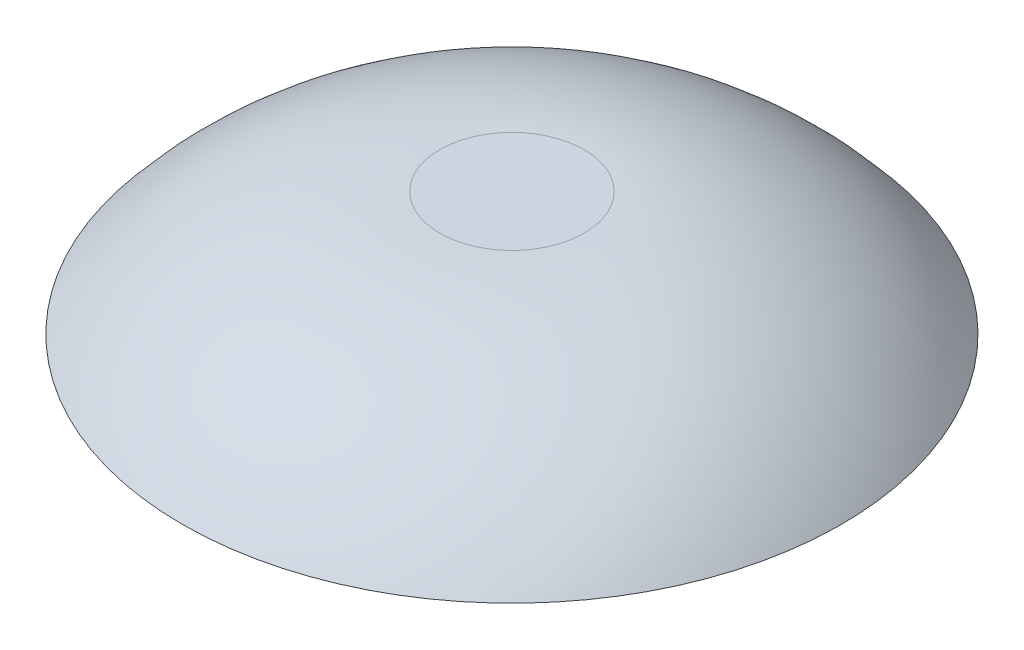
ISO-10303-21;
HEADER;
FILE_DESCRIPTION(('STEP AP214'),'2;1');
FILE_NAME('part.step','',(''),(''),'','','');
FILE_SCHEMA(('AUTOMOTIVE_DESIGN { 1 0 10303 214 1 1 1 1 }'));
ENDSEC;
DATA;
#1=APPLICATION_CONTEXT('core data for automotive mechanical design processes');
#2=APPLICATION_PROTOCOL_DEFINITION('international standard','automotive_design',2000,#1);
#3=PRODUCT_CONTEXT('',#1,'mechanical');
#4=PRODUCT('Part','Part','',(#3));
#5=PRODUCT_RELATED_PRODUCT_CATEGORY('part','',(#4));
#6=PRODUCT_DEFINITION_FORMATION('','',#4);
#7=PRODUCT_DEFINITION_CONTEXT('part definition',#1,'design');
#8=PRODUCT_DEFINITION('design','',#6,#7);
#9=PRODUCT_DEFINITION_SHAPE('','',#8);
#10=(LENGTH_UNIT() NAMED_UNIT(*) SI_UNIT(.MILLI.,.METRE.));
#11=(NAMED_UNIT(*) PLANE_ANGLE_UNIT() SI_UNIT($,.RADIAN.));
#12=(NAMED_UNIT(*) SI_UNIT($,.STERADIAN.) SOLID_ANGLE_UNIT());
#13=UNCERTAINTY_MEASURE_WITH_UNIT(LENGTH_MEASURE(1.E-05),#10,'distance_accuracy_value','');
#14=(GEOMETRIC_REPRESENTATION_CONTEXT(3) GLOBAL_UNCERTAINTY_ASSIGNED_CONTEXT((#13)) GLOBAL_UNIT_ASSIGNED_CONTEXT((#10,
#11,#12)) REPRESENTATION_CONTEXT('',''));
#15=CARTESIAN_POINT('',(0.,0.,0.));
#16=DIRECTION('',(0.,0.,1.));
#17=DIRECTION('',(1.,0.,0.));
#18=AXIS2_PLACEMENT_3D('',#15,#16,#17);
#19=CARTESIAN_POINT('',(3.1,7.,0.));
#20=DIRECTION('',(1.,0.,0.));
#21=DIRECTION('',(0.,0.,-1.));
#22=AXIS2_PLACEMENT_3D('',#19,#20,#21);
#23=PLANE('',#22);
#24=DIRECTION('',(0.,-1.,0.));
#25=VECTOR('',#24,1.);
#26=CARTESIAN_POINT('',(3.1,7.,1.78978583448784));
#27=LINE('',#26,#25);
#28=CARTESIAN_POINT('',(3.1,7.,1.78978583448784));
#29=VERTEX_POINT('',#28);
#30=CARTESIAN_POINT('',(3.1,2.5,1.78978583448784));
#31=VERTEX_POINT('',#30);
#32=EDGE_CURVE('E107',#29,#31,#27,.T.);
#33=ORIENTED_EDGE('',*,*,#32,.T.);
#34=DIRECTION('',(0.,0.,-1.));
#35=VECTOR('',#34,1.);
#36=CARTESIAN_POINT('',(3.1,2.5,0.));
#37=LINE('',#36,#35);
#38=CARTESIAN_POINT('',(3.1,2.5,-1.78978583448784));
#39=VERTEX_POINT('',#38);
#40=EDGE_CURVE('E96',#31,#39,#37,.T.);
#41=ORIENTED_EDGE('',*,*,#40,.T.);
#42=DIRECTION('',(0.,-1.,0.));
#43=VECTOR('',#42,1.);
#44=CARTESIAN_POINT('',(3.1,7.,-1.78978583448784));
#45=LINE('',#44,#43);
#46=CARTESIAN_POINT('',(3.1,7.,-1.78978583448784));
#47=VERTEX_POINT('',#46);
#48=EDGE_CURVE('E105',#47,#39,#45,.T.);
#49=ORIENTED_EDGE('',*,*,#48,.F.);
#50=DIRECTION('',(0.,0.,1.));
#51=VECTOR('',#50,1.);
#52=CARTESIAN_POINT('',(3.1,7.,0.));
#53=LINE('',#52,#51);
#54=EDGE_CURVE('E269',#47,#29,#53,.T.);
#55=ORIENTED_EDGE('',*,*,#54,.T.);
#56=EDGE_LOOP('',(#33,#41,#49,#55));
#57=FACE_BOUND('',#56,.T.);
#58=ADVANCED_FACE('F43',(#57),#23,.T.);
#59=CARTESIAN_POINT('',(1.55,7.,2.68467875173176));
#60=DIRECTION('',(0.5,0.,0.866025403784439));
#61=DIRECTION('',(0.866025403784439,0.,-0.5));
#62=AXIS2_PLACEMENT_3D('',#59,#60,#61);
#63=PLANE('',#62);
#64=DIRECTION('',(0.,-1.,0.));
#65=VECTOR('',#64,1.);
#66=CARTESIAN_POINT('',(0.,7.,3.57957166897568));
#67=LINE('',#66,#65);
#68=CARTESIAN_POINT('',(0.,7.,3.57957166897568));
#69=VERTEX_POINT('',#68);
#70=CARTESIAN_POINT('',(0.,2.5,3.57957166897568));
#71=VERTEX_POINT('',#70);
#72=EDGE_CURVE('E282',#69,#71,#67,.T.);
#73=ORIENTED_EDGE('',*,*,#72,.T.);
#74=DIRECTION('',(0.866025403784439,0.,-0.5));
#75=VECTOR('',#74,1.);
#76=CARTESIAN_POINT('',(1.55,2.5,2.68467875173176));
#77=LINE('',#76,#75);
#78=EDGE_CURVE('E110',#71,#31,#77,.T.);
#79=ORIENTED_EDGE('',*,*,#78,.T.);
#80=ORIENTED_EDGE('',*,*,#32,.F.);
#81=DIRECTION('',(-0.866025403784439,0.,0.5));
#82=VECTOR('',#81,1.);
#83=CARTESIAN_POINT('',(1.55,7.,2.68467875173176));
#84=LINE('',#83,#82);
#85=EDGE_CURVE('E66',#29,#69,#84,.T.);
#86=ORIENTED_EDGE('',*,*,#85,.T.);
#87=EDGE_LOOP('',(#73,#79,#80,#86));
#88=FACE_BOUND('',#87,.T.);
#89=ADVANCED_FACE('F149',(#88),#63,.T.);
#90=CARTESIAN_POINT('',(-1.55,7.,2.68467875173176));
#91=DIRECTION('',(-0.5,0.,0.866025403784438));
#92=DIRECTION('',(0.866025403784439,0.,0.5));
#93=AXIS2_PLACEMENT_3D('',#90,#91,#92);
#94=PLANE('',#93);
#95=DIRECTION('',(0.,-1.,0.));
#96=VECTOR('',#95,1.);
#97=CARTESIAN_POINT('',(-3.1,7.,1.78978583448784));
#98=LINE('',#97,#96);
#99=CARTESIAN_POINT('',(-3.1,7.,1.78978583448784));
#100=VERTEX_POINT('',#99);
#101=CARTESIAN_POINT('',(-3.1,2.5,1.78978583448784));
#102=VERTEX_POINT('',#101);
#103=EDGE_CURVE('E286',#100,#102,#98,.T.);
#104=ORIENTED_EDGE('',*,*,#103,.T.);
#105=DIRECTION('',(0.866025403784439,0.,0.5));
#106=VECTOR('',#105,1.);
#107=CARTESIAN_POINT('',(-1.55,2.5,2.68467875173176));
#108=LINE('',#107,#106);
#109=EDGE_CURVE('E311',#102,#71,#108,.T.);
#110=ORIENTED_EDGE('',*,*,#109,.T.);
#111=ORIENTED_EDGE('',*,*,#72,.F.);
#112=DIRECTION('',(-0.866025403784439,0.,-0.5));
#113=VECTOR('',#112,1.);
#114=CARTESIAN_POINT('',(-1.55,7.,2.68467875173176));
#115=LINE('',#114,#113);
#116=EDGE_CURVE('E303',#69,#100,#115,.T.);
#117=ORIENTED_EDGE('',*,*,#116,.T.);
#118=EDGE_LOOP('',(#104,#110,#111,#117));
#119=FACE_BOUND('',#118,.T.);
#120=ADVANCED_FACE('F154',(#119),#94,.T.);
#121=CARTESIAN_POINT('',(-3.1,7.,0.));
#122=DIRECTION('',(-1.,0.,0.));
#123=DIRECTION('',(0.,0.,1.));
#124=AXIS2_PLACEMENT_3D('',#121,#122,#123);
#125=PLANE('',#124);
#126=DIRECTION('',(0.,-1.,0.));
#127=VECTOR('',#126,1.);
#128=CARTESIAN_POINT('',(-3.1,7.,-1.78978583448784));
#129=LINE('',#128,#127);
#130=CARTESIAN_POINT('',(-3.1,7.,-1.78978583448784));
#131=VERTEX_POINT('',#130);
#132=CARTESIAN_POINT('',(-3.1,2.5,-1.78978583448784));
#133=VERTEX_POINT('',#132);
#134=EDGE_CURVE('E121',#131,#133,#129,.T.);
#135=ORIENTED_EDGE('',*,*,#134,.T.);
#136=DIRECTION('',(0.,0.,1.));
#137=VECTOR('',#136,1.);
#138=CARTESIAN_POINT('',(-3.1,2.5,0.));
#139=LINE('',#138,#137);
#140=EDGE_CURVE('E294',#133,#102,#139,.T.);
#141=ORIENTED_EDGE('',*,*,#140,.T.);
#142=ORIENTED_EDGE('',*,*,#103,.F.);
#143=DIRECTION('',(0.,0.,-1.));
#144=VECTOR('',#143,1.);
#145=CARTESIAN_POINT('',(-3.1,7.,0.));
#146=LINE('',#145,#144);
#147=EDGE_CURVE('E296',#100,#131,#146,.T.);
#148=ORIENTED_EDGE('',*,*,#147,.T.);
#149=EDGE_LOOP('',(#135,#141,#142,#148));
#150=FACE_BOUND('',#149,.T.);
#151=ADVANCED_FACE('F168',(#150),#125,.T.);
#152=CARTESIAN_POINT('',(-1.55,7.,-2.68467875173176));
#153=DIRECTION('',(-0.5,0.,-0.866025403784439));
#154=DIRECTION('',(-0.866025403784439,0.,0.5));
#155=AXIS2_PLACEMENT_3D('',#152,#153,#154);
#156=PLANE('',#155);
#157=DIRECTION('',(0.,-1.,0.));
#158=VECTOR('',#157,1.);
#159=CARTESIAN_POINT('',(0.,7.,-3.57957166897568));
#160=LINE('',#159,#158);
#161=CARTESIAN_POINT('',(0.,7.,-3.57957166897568));
#162=VERTEX_POINT('',#161);
#163=CARTESIAN_POINT('',(0.,2.5,-3.57957166897568));
#164=VERTEX_POINT('',#163);
#165=EDGE_CURVE('E116',#162,#164,#160,.T.);
#166=ORIENTED_EDGE('',*,*,#165,.T.);
#167=DIRECTION('',(-0.866025403784439,0.,0.5));
#168=VECTOR('',#167,1.);
#169=CARTESIAN_POINT('',(-1.55,2.5,-2.68467875173176));
#170=LINE('',#169,#168);
#171=EDGE_CURVE('E59',#164,#133,#170,.T.);
#172=ORIENTED_EDGE('',*,*,#171,.T.);
#173=ORIENTED_EDGE('',*,*,#134,.F.);
#174=DIRECTION('',(0.866025403784439,0.,-0.5));
#175=VECTOR('',#174,1.);
#176=CARTESIAN_POINT('',(-1.55,7.,-2.68467875173176));
#177=LINE('',#176,#175);
#178=EDGE_CURVE('E298',#131,#162,#177,.T.);
#179=ORIENTED_EDGE('',*,*,#178,.T.);
#180=EDGE_LOOP('',(#166,#172,#173,#179));
#181=FACE_BOUND('',#180,.T.);
#182=ADVANCED_FACE('F164',(#181),#156,.T.);
#183=CARTESIAN_POINT('',(1.55,7.,-2.68467875173176));
#184=DIRECTION('',(0.5,0.,-0.866025403784439));
#185=DIRECTION('',(-0.866025403784439,0.,-0.5));
#186=AXIS2_PLACEMENT_3D('',#183,#184,#185);
#187=PLANE('',#186);
#188=ORIENTED_EDGE('',*,*,#48,.T.);
#189=DIRECTION('',(-0.866025403784439,0.,-0.5));
#190=VECTOR('',#189,1.);
#191=CARTESIAN_POINT('',(1.55,2.5,-2.68467875173176));
#192=LINE('',#191,#190);
#193=EDGE_CURVE('E11',#39,#164,#192,.T.);
#194=ORIENTED_EDGE('',*,*,#193,.T.);
#195=ORIENTED_EDGE('',*,*,#165,.F.);
#196=DIRECTION('',(0.866025403784439,0.,0.5));
#197=VECTOR('',#196,1.);
#198=CARTESIAN_POINT('',(1.55,7.,-2.68467875173176));
#199=LINE('',#198,#197);
#200=EDGE_CURVE('E114',#162,#47,#199,.T.);
#201=ORIENTED_EDGE('',*,*,#200,.T.);
#202=EDGE_LOOP('',(#188,#194,#195,#201));
#203=FACE_BOUND('',#202,.T.);
#204=ADVANCED_FACE('F112',(#203),#187,.T.);
#205=CARTESIAN_POINT('',(0.,7.5,0.));
#206=DIRECTION('',(0.,1.,0.));
#207=DIRECTION('',(0.,0.,1.));
#208=AXIS2_PLACEMENT_3D('',#205,#206,#207);
#209=PLANE('',#208);
#210=CARTESIAN_POINT('',(0.,7.5,0.));
#211=DIRECTION('',(0.,1.,0.));
#212=DIRECTION('',(0.,0.,1.));
#213=AXIS2_PLACEMENT_3D('',#210,#211,#212);
#214=CIRCLE('',#213,4.38750500400401);
#215=CARTESIAN_POINT('',(0.,7.5,4.38750500400401));
#216=VERTEX_POINT('',#215);
#217=EDGE_CURVE('E52',#216,#216,#214,.T.);
#218=ORIENTED_EDGE('',*,*,#217,.T.);
#219=EDGE_LOOP('',(#218));
#220=FACE_BOUND('',#219,.T.);
#221=ADVANCED_FACE('F134',(#220),#209,.T.);
#222=CARTESIAN_POINT('',(0.,0.,0.));
#223=DIRECTION('',(0.,1.,0.));
#224=DIRECTION('',(0.,0.,1.));
#225=AXIS2_PLACEMENT_3D('',#222,#223,#224);
#226=PLANE('',#225);
#227=CARTESIAN_POINT('',(0.,0.,0.));
#228=DIRECTION('',(0.,-1.,0.));
#229=DIRECTION('',(0.,0.,-1.));
#230=AXIS2_PLACEMENT_3D('',#227,#228,#229);
#231=CIRCLE('',#230,6.925);
#232=CARTESIAN_POINT('',(0.,0.,-6.925));
#233=VERTEX_POINT('',#232);
#234=EDGE_CURVE('E109',#233,#233,#231,.T.);
#235=ORIENTED_EDGE('',*,*,#234,.F.);
#236=EDGE_LOOP('',(#235));
#237=FACE_BOUND('',#236,.T.);
#238=CARTESIAN_POINT('',(0.,0.,0.));
#239=DIRECTION('',(0.,1.,0.));
#240=DIRECTION('',(0.,0.,1.));
#241=AXIS2_PLACEMENT_3D('',#238,#239,#240);
#242=CIRCLE('',#241,20.);
#243=CARTESIAN_POINT('',(0.,0.,20.));
#244=VERTEX_POINT('',#243);
#245=EDGE_CURVE('E127',#244,#244,#242,.T.);
#246=ORIENTED_EDGE('',*,*,#245,.F.);
#247=EDGE_LOOP('',(#246));
#248=FACE_BOUND('',#247,.T.);
#249=ADVANCED_FACE('F138',(#237,#248),#226,.F.);
#250=CARTESIAN_POINT('',(0.,-12.5,0.));
#251=DIRECTION('',(0.,-1.,0.));
#252=DIRECTION('',(0.,0.,-1.));
#253=AXIS2_PLACEMENT_3D('',#250,#251,#252);
#254=DEGENERATE_TOROIDAL_SURFACE('',#253,4.38750500400401,20.,.T.);
#255=ORIENTED_EDGE('',*,*,#245,.T.);
#256=EDGE_LOOP('',(#255));
#257=FACE_BOUND('',#256,.T.);
#258=ORIENTED_EDGE('',*,*,#217,.F.);
#259=EDGE_LOOP('',(#258));
#260=FACE_BOUND('',#259,.T.);
#261=ADVANCED_FACE('F45',(#257,#260),#254,.T.);
#262=CARTESIAN_POINT('',(0.,7.,0.));
#263=DIRECTION('',(0.,-1.,0.));
#264=DIRECTION('',(0.,0.,-1.));
#265=AXIS2_PLACEMENT_3D('',#262,#263,#264);
#266=CYLINDRICAL_SURFACE('',#265,6.925);
#267=CARTESIAN_POINT('',(0.,7.,0.));
#268=DIRECTION('',(0.,-1.,0.));
#269=DIRECTION('',(0.,0.,-1.));
#270=AXIS2_PLACEMENT_3D('',#267,#268,#269);
#271=CIRCLE('',#270,6.925);
#272=CARTESIAN_POINT('',(0.,7.,-6.925));
#273=VERTEX_POINT('',#272);
#274=EDGE_CURVE('E117',#273,#273,#271,.T.);
#275=ORIENTED_EDGE('',*,*,#274,.F.);
#276=EDGE_LOOP('',(#275));
#277=FACE_BOUND('',#276,.T.);
#278=ORIENTED_EDGE('',*,*,#234,.T.);
#279=EDGE_LOOP('',(#278));
#280=FACE_BOUND('',#279,.T.);
#281=ADVANCED_FACE('F137',(#277,#280),#266,.F.);
#282=CARTESIAN_POINT('',(0.,7.,0.));
#283=DIRECTION('',(0.,-1.,0.));
#284=DIRECTION('',(0.,0.,-1.));
#285=AXIS2_PLACEMENT_3D('',#282,#283,#284);
#286=PLANE('',#285);
#287=ORIENTED_EDGE('',*,*,#54,.F.);
#288=ORIENTED_EDGE('',*,*,#200,.F.);
#289=ORIENTED_EDGE('',*,*,#178,.F.);
#290=ORIENTED_EDGE('',*,*,#147,.F.);
#291=ORIENTED_EDGE('',*,*,#116,.F.);
#292=ORIENTED_EDGE('',*,*,#85,.F.);
#293=EDGE_LOOP('',(#287,#288,#289,#290,#291,#292));
#294=FACE_BOUND('',#293,.T.);
#295=ORIENTED_EDGE('',*,*,#274,.T.);
#296=EDGE_LOOP('',(#295));
#297=FACE_BOUND('',#296,.T.);
#298=ADVANCED_FACE('F144',(#294,#297),#286,.T.);
#299=CARTESIAN_POINT('',(0.,2.5,0.));
#300=DIRECTION('',(0.,-1.,0.));
#301=DIRECTION('',(0.,0.,-1.));
#302=AXIS2_PLACEMENT_3D('',#299,#300,#301);
#303=PLANE('',#302);
#304=ORIENTED_EDGE('',*,*,#78,.F.);
#305=ORIENTED_EDGE('',*,*,#109,.F.);
#306=ORIENTED_EDGE('',*,*,#140,.F.);
#307=ORIENTED_EDGE('',*,*,#171,.F.);
#308=ORIENTED_EDGE('',*,*,#193,.F.);
#309=ORIENTED_EDGE('',*,*,#40,.F.);
#310=EDGE_LOOP('',(#304,#305,#306,#307,#308,#309));
#311=FACE_BOUND('',#310,.T.);
#312=ADVANCED_FACE('F95',(#311),#303,.T.);
#313=CLOSED_SHELL('',(#58,#89,#120,#151,#182,#204,#221,#249,#261,#281,#298,#312));
#314=MANIFOLD_SOLID_BREP('B2',#313);
#315=ADVANCED_BREP_SHAPE_REPRESENTATION('',(#18,#314),#14);
#316=SHAPE_DEFINITION_REPRESENTATION(#9,#315);
ENDSEC;
END-ISO-10303-21;
